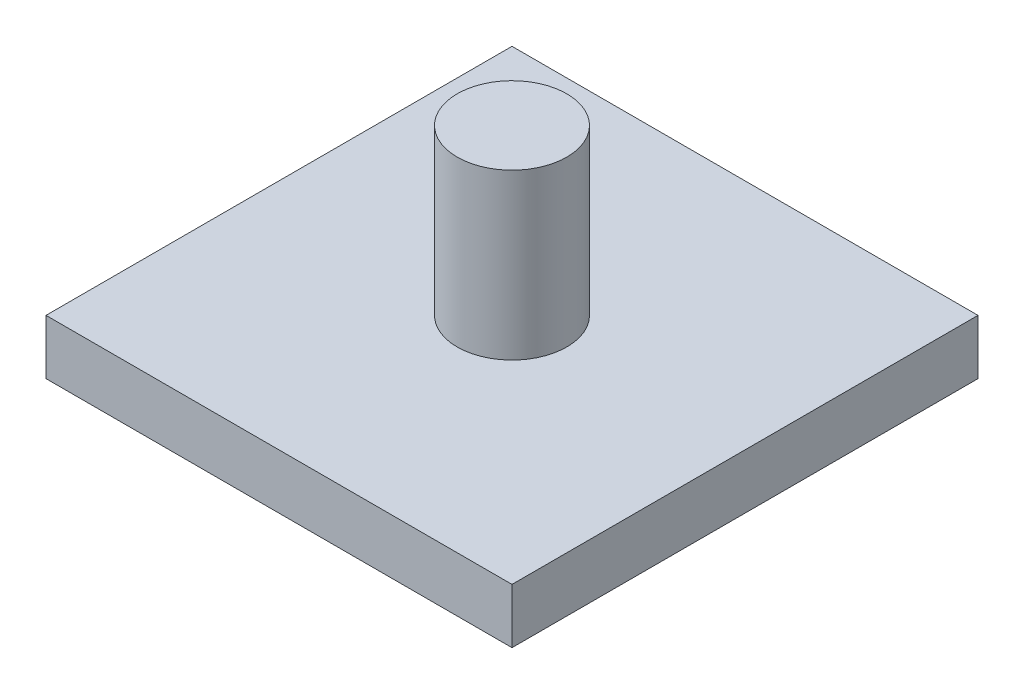
ISO-10303-21;
HEADER;
FILE_DESCRIPTION(('STEP AP214'),'2;1');
FILE_NAME('part.step','',(''),(''),'','','');
FILE_SCHEMA(('AUTOMOTIVE_DESIGN { 1 0 10303 214 1 1 1 1 }'));
ENDSEC;
DATA;
#1=APPLICATION_CONTEXT('core data for automotive mechanical design processes');
#2=APPLICATION_PROTOCOL_DEFINITION('international standard','automotive_design',2000,#1);
#3=PRODUCT_CONTEXT('',#1,'mechanical');
#4=PRODUCT('Part','Part','',(#3));
#5=PRODUCT_RELATED_PRODUCT_CATEGORY('part','',(#4));
#6=PRODUCT_DEFINITION_FORMATION('','',#4);
#7=PRODUCT_DEFINITION_CONTEXT('part definition',#1,'design');
#8=PRODUCT_DEFINITION('design','',#6,#7);
#9=PRODUCT_DEFINITION_SHAPE('','',#8);
#10=(LENGTH_UNIT() NAMED_UNIT(*) SI_UNIT(.MILLI.,.METRE.));
#11=(NAMED_UNIT(*) PLANE_ANGLE_UNIT() SI_UNIT($,.RADIAN.));
#12=(NAMED_UNIT(*) SI_UNIT($,.STERADIAN.) SOLID_ANGLE_UNIT());
#13=UNCERTAINTY_MEASURE_WITH_UNIT(LENGTH_MEASURE(1.E-05),#10,'distance_accuracy_value','');
#14=(GEOMETRIC_REPRESENTATION_CONTEXT(3) GLOBAL_UNCERTAINTY_ASSIGNED_CONTEXT((#13)) GLOBAL_UNIT_ASSIGNED_CONTEXT((#10,
#11,#12)) REPRESENTATION_CONTEXT('',''));
#15=CARTESIAN_POINT('',(0.,0.,0.));
#16=DIRECTION('',(0.,0.,1.));
#17=DIRECTION('',(1.,0.,0.));
#18=AXIS2_PLACEMENT_3D('',#15,#16,#17);
#19=CARTESIAN_POINT('',(-5.95494186046512,2.,-7.59811046511628));
#20=DIRECTION('',(1.,0.,0.));
#21=DIRECTION('',(0.,0.,-1.));
#22=AXIS2_PLACEMENT_3D('',#19,#20,#21);
#23=PLANE('',#22);
#24=DIRECTION('',(0.,0.,1.));
#25=VECTOR('',#24,1.);
#26=CARTESIAN_POINT('',(-5.95494186046512,0.,-7.59811046511628));
#27=LINE('',#26,#25);
#28=CARTESIAN_POINT('',(-5.95494186046512,0.,-7.59811046511628));
#29=VERTEX_POINT('',#28);
#30=CARTESIAN_POINT('',(-5.95494186046512,0.,9.40188953488372));
#31=VERTEX_POINT('',#30);
#32=EDGE_CURVE('E100',#29,#31,#27,.T.);
#33=ORIENTED_EDGE('',*,*,#32,.T.);
#34=DIRECTION('',(0.,-1.,0.));
#35=VECTOR('',#34,1.);
#36=CARTESIAN_POINT('',(-5.95494186046512,2.,9.40188953488372));
#37=LINE('',#36,#35);
#38=CARTESIAN_POINT('',(-5.95494186046512,2.,9.40188953488372));
#39=VERTEX_POINT('',#38);
#40=EDGE_CURVE('E37',#39,#31,#37,.T.);
#41=ORIENTED_EDGE('',*,*,#40,.F.);
#42=DIRECTION('',(0.,0.,1.));
#43=VECTOR('',#42,1.);
#44=CARTESIAN_POINT('',(-5.95494186046512,2.,-7.59811046511628));
#45=LINE('',#44,#43);
#46=CARTESIAN_POINT('',(-5.95494186046512,2.,-7.59811046511628));
#47=VERTEX_POINT('',#46);
#48=EDGE_CURVE('E87',#47,#39,#45,.T.);
#49=ORIENTED_EDGE('',*,*,#48,.F.);
#50=DIRECTION('',(0.,-1.,0.));
#51=VECTOR('',#50,1.);
#52=CARTESIAN_POINT('',(-5.95494186046512,2.,-7.59811046511628));
#53=LINE('',#52,#51);
#54=EDGE_CURVE('E96',#47,#29,#53,.T.);
#55=ORIENTED_EDGE('',*,*,#54,.T.);
#56=EDGE_LOOP('',(#33,#41,#49,#55));
#57=FACE_BOUND('',#56,.T.);
#58=ADVANCED_FACE('F34',(#57),#23,.F.);
#59=CARTESIAN_POINT('',(-5.95494186046512,2.,9.40188953488372));
#60=DIRECTION('',(0.,0.,-1.));
#61=DIRECTION('',(-1.,0.,0.));
#62=AXIS2_PLACEMENT_3D('',#59,#60,#61);
#63=PLANE('',#62);
#64=DIRECTION('',(1.,0.,0.));
#65=VECTOR('',#64,1.);
#66=CARTESIAN_POINT('',(-5.95494186046512,0.,9.40188953488372));
#67=LINE('',#66,#65);
#68=CARTESIAN_POINT('',(11.0450581395349,0.,9.40188953488372));
#69=VERTEX_POINT('',#68);
#70=EDGE_CURVE('E92',#31,#69,#67,.T.);
#71=ORIENTED_EDGE('',*,*,#70,.T.);
#72=DIRECTION('',(0.,-1.,0.));
#73=VECTOR('',#72,1.);
#74=CARTESIAN_POINT('',(11.0450581395349,2.,9.40188953488372));
#75=LINE('',#74,#73);
#76=CARTESIAN_POINT('',(11.0450581395349,2.,9.40188953488372));
#77=VERTEX_POINT('',#76);
#78=EDGE_CURVE('E90',#77,#69,#75,.T.);
#79=ORIENTED_EDGE('',*,*,#78,.F.);
#80=DIRECTION('',(1.,0.,0.));
#81=VECTOR('',#80,1.);
#82=CARTESIAN_POINT('',(-5.95494186046512,2.,9.40188953488372));
#83=LINE('',#82,#81);
#84=EDGE_CURVE('E82',#39,#77,#83,.T.);
#85=ORIENTED_EDGE('',*,*,#84,.F.);
#86=ORIENTED_EDGE('',*,*,#40,.T.);
#87=EDGE_LOOP('',(#71,#79,#85,#86));
#88=FACE_BOUND('',#87,.T.);
#89=ADVANCED_FACE('F91',(#88),#63,.F.);
#90=CARTESIAN_POINT('',(11.0450581395349,2.,-7.59811046511628));
#91=DIRECTION('',(-1.,0.,0.));
#92=DIRECTION('',(0.,0.,1.));
#93=AXIS2_PLACEMENT_3D('',#90,#91,#92);
#94=PLANE('',#93);
#95=DIRECTION('',(0.,0.,-1.));
#96=VECTOR('',#95,1.);
#97=CARTESIAN_POINT('',(11.0450581395349,0.,-7.59811046511628));
#98=LINE('',#97,#96);
#99=CARTESIAN_POINT('',(11.0450581395349,0.,-7.59811046511628));
#100=VERTEX_POINT('',#99);
#101=EDGE_CURVE('E68',#69,#100,#98,.T.);
#102=ORIENTED_EDGE('',*,*,#101,.T.);
#103=DIRECTION('',(0.,-1.,0.));
#104=VECTOR('',#103,1.);
#105=CARTESIAN_POINT('',(11.0450581395349,2.,-7.59811046511628));
#106=LINE('',#105,#104);
#107=CARTESIAN_POINT('',(11.0450581395349,2.,-7.59811046511628));
#108=VERTEX_POINT('',#107);
#109=EDGE_CURVE('E93',#108,#100,#106,.T.);
#110=ORIENTED_EDGE('',*,*,#109,.F.);
#111=DIRECTION('',(0.,0.,-1.));
#112=VECTOR('',#111,1.);
#113=CARTESIAN_POINT('',(11.0450581395349,2.,-7.59811046511628));
#114=LINE('',#113,#112);
#115=EDGE_CURVE('E85',#77,#108,#114,.T.);
#116=ORIENTED_EDGE('',*,*,#115,.F.);
#117=ORIENTED_EDGE('',*,*,#78,.T.);
#118=EDGE_LOOP('',(#102,#110,#116,#117));
#119=FACE_BOUND('',#118,.T.);
#120=ADVANCED_FACE('F94',(#119),#94,.F.);
#121=CARTESIAN_POINT('',(-5.95494186046512,2.,-7.59811046511628));
#122=DIRECTION('',(0.,0.,1.));
#123=DIRECTION('',(1.,0.,0.));
#124=AXIS2_PLACEMENT_3D('',#121,#122,#123);
#125=PLANE('',#124);
#126=DIRECTION('',(-1.,0.,0.));
#127=VECTOR('',#126,1.);
#128=CARTESIAN_POINT('',(-5.95494186046512,0.,-7.59811046511628));
#129=LINE('',#128,#127);
#130=EDGE_CURVE('E74',#100,#29,#129,.T.);
#131=ORIENTED_EDGE('',*,*,#130,.T.);
#132=ORIENTED_EDGE('',*,*,#54,.F.);
#133=DIRECTION('',(-1.,0.,0.));
#134=VECTOR('',#133,1.);
#135=CARTESIAN_POINT('',(-5.95494186046512,2.,-7.59811046511628));
#136=LINE('',#135,#134);
#137=EDGE_CURVE('E51',#108,#47,#136,.T.);
#138=ORIENTED_EDGE('',*,*,#137,.F.);
#139=ORIENTED_EDGE('',*,*,#109,.T.);
#140=EDGE_LOOP('',(#131,#132,#138,#139));
#141=FACE_BOUND('',#140,.T.);
#142=ADVANCED_FACE('F108',(#141),#125,.F.);
#143=CARTESIAN_POINT('',(0.,2.,0.));
#144=DIRECTION('',(0.,1.,0.));
#145=DIRECTION('',(0.,0.,1.));
#146=AXIS2_PLACEMENT_3D('',#143,#144,#145);
#147=PLANE('',#146);
#148=CARTESIAN_POINT('',(2.54505813953488,2.,0.901889534883724));
#149=DIRECTION('',(0.,1.,0.));
#150=DIRECTION('',(0.,0.,1.));
#151=AXIS2_PLACEMENT_3D('',#148,#149,#150);
#152=CIRCLE('',#151,2.);
#153=CARTESIAN_POINT('',(2.54505813953488,2.,2.90188953488372));
#154=VERTEX_POINT('',#153);
#155=EDGE_CURVE('E11',#154,#154,#152,.T.);
#156=ORIENTED_EDGE('',*,*,#155,.F.);
#157=EDGE_LOOP('',(#156));
#158=FACE_BOUND('',#157,.T.);
#159=ORIENTED_EDGE('',*,*,#48,.T.);
#160=ORIENTED_EDGE('',*,*,#84,.T.);
#161=ORIENTED_EDGE('',*,*,#115,.T.);
#162=ORIENTED_EDGE('',*,*,#137,.T.);
#163=EDGE_LOOP('',(#159,#160,#161,#162));
#164=FACE_BOUND('',#163,.T.);
#165=ADVANCED_FACE('F83',(#158,#164),#147,.T.);
#166=CARTESIAN_POINT('',(0.,0.,0.));
#167=DIRECTION('',(0.,1.,0.));
#168=DIRECTION('',(0.,0.,1.));
#169=AXIS2_PLACEMENT_3D('',#166,#167,#168);
#170=PLANE('',#169);
#171=ORIENTED_EDGE('',*,*,#32,.F.);
#172=ORIENTED_EDGE('',*,*,#130,.F.);
#173=ORIENTED_EDGE('',*,*,#101,.F.);
#174=ORIENTED_EDGE('',*,*,#70,.F.);
#175=EDGE_LOOP('',(#171,#172,#173,#174));
#176=FACE_BOUND('',#175,.T.);
#177=ADVANCED_FACE('F111',(#176),#170,.F.);
#178=CARTESIAN_POINT('',(2.54505813953488,8.,0.901889534883724));
#179=DIRECTION('',(0.,-1.,0.));
#180=DIRECTION('',(0.,0.,-1.));
#181=AXIS2_PLACEMENT_3D('',#178,#179,#180);
#182=CYLINDRICAL_SURFACE('',#181,2.);
#183=CARTESIAN_POINT('',(2.54505813953488,8.,0.901889534883724));
#184=DIRECTION('',(0.,1.,0.));
#185=DIRECTION('',(0.,0.,1.));
#186=AXIS2_PLACEMENT_3D('',#183,#184,#185);
#187=CIRCLE('',#186,2.);
#188=CARTESIAN_POINT('',(2.54505813953488,8.,2.90188953488372));
#189=VERTEX_POINT('',#188);
#190=EDGE_CURVE('E103',#189,#189,#187,.T.);
#191=ORIENTED_EDGE('',*,*,#190,.F.);
#192=EDGE_LOOP('',(#191));
#193=FACE_BOUND('',#192,.T.);
#194=ORIENTED_EDGE('',*,*,#155,.T.);
#195=EDGE_LOOP('',(#194));
#196=FACE_BOUND('',#195,.T.);
#197=ADVANCED_FACE('F119',(#193,#196),#182,.T.);
#198=CARTESIAN_POINT('',(2.54505813953488,8.,0.901889534883724));
#199=DIRECTION('',(0.,1.,0.));
#200=DIRECTION('',(0.,0.,1.));
#201=AXIS2_PLACEMENT_3D('',#198,#199,#200);
#202=PLANE('',#201);
#203=ORIENTED_EDGE('',*,*,#190,.T.);
#204=EDGE_LOOP('',(#203));
#205=FACE_BOUND('',#204,.T.);
#206=ADVANCED_FACE('F117',(#205),#202,.T.);
#207=CLOSED_SHELL('',(#58,#89,#120,#142,#165,#177,#197,#206));
#208=MANIFOLD_SOLID_BREP('B2',#207);
#209=ADVANCED_BREP_SHAPE_REPRESENTATION('',(#18,#208),#14);
#210=SHAPE_DEFINITION_REPRESENTATION(#9,#209);
ENDSEC;
END-ISO-10303-21;
